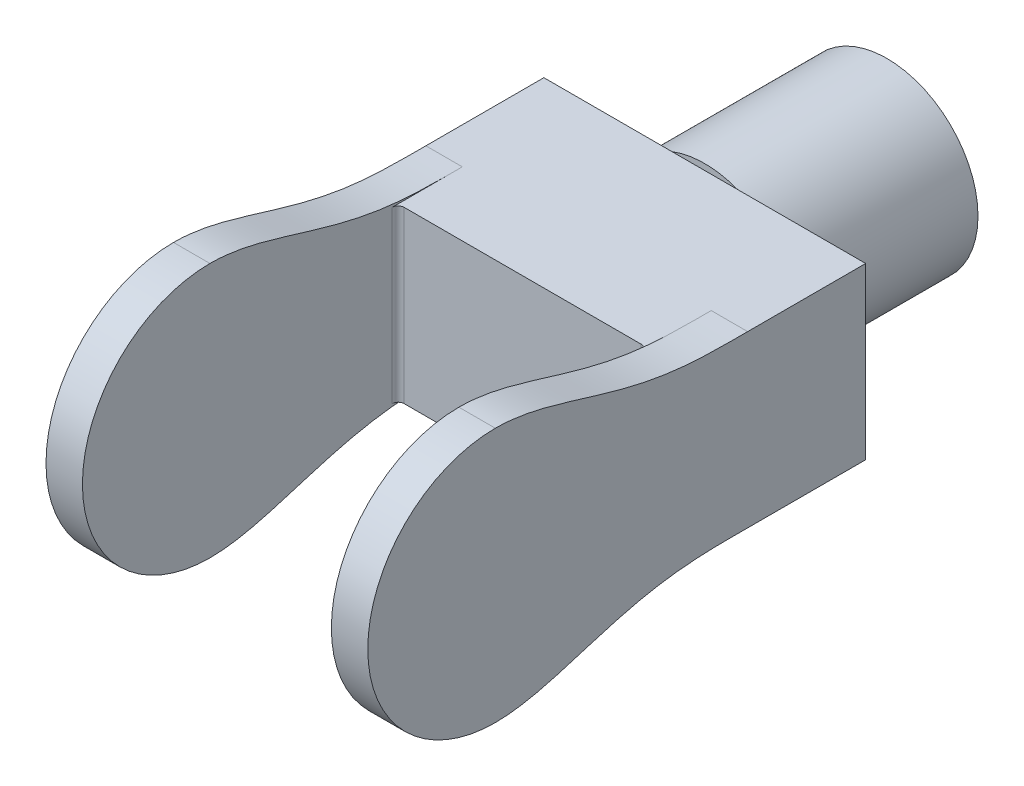
ISO-10303-21;
HEADER;
FILE_DESCRIPTION(('STEP AP214'),'2;1');
FILE_NAME('part.step','',(''),(''),'','','');
FILE_SCHEMA(('AUTOMOTIVE_DESIGN { 1 0 10303 214 1 1 1 1 }'));
ENDSEC;
DATA;
#1=APPLICATION_CONTEXT('core data for automotive mechanical design processes');
#2=APPLICATION_PROTOCOL_DEFINITION('international standard','automotive_design',2000,#1);
#3=PRODUCT_CONTEXT('',#1,'mechanical');
#4=PRODUCT('Part','Part','',(#3));
#5=PRODUCT_RELATED_PRODUCT_CATEGORY('part','',(#4));
#6=PRODUCT_DEFINITION_FORMATION('','',#4);
#7=PRODUCT_DEFINITION_CONTEXT('part definition',#1,'design');
#8=PRODUCT_DEFINITION('design','',#6,#7);
#9=PRODUCT_DEFINITION_SHAPE('','',#8);
#10=(LENGTH_UNIT() NAMED_UNIT(*) SI_UNIT(.MILLI.,.METRE.));
#11=(NAMED_UNIT(*) PLANE_ANGLE_UNIT() SI_UNIT($,.RADIAN.));
#12=(NAMED_UNIT(*) SI_UNIT($,.STERADIAN.) SOLID_ANGLE_UNIT());
#13=UNCERTAINTY_MEASURE_WITH_UNIT(LENGTH_MEASURE(1.E-05),#10,'distance_accuracy_value','');
#14=(GEOMETRIC_REPRESENTATION_CONTEXT(3) GLOBAL_UNCERTAINTY_ASSIGNED_CONTEXT((#13)) GLOBAL_UNIT_ASSIGNED_CONTEXT((#10,
#11,#12)) REPRESENTATION_CONTEXT('',''));
#15=CARTESIAN_POINT('',(0.,0.,0.));
#16=DIRECTION('',(0.,0.,1.));
#17=DIRECTION('',(1.,0.,0.));
#18=AXIS2_PLACEMENT_3D('',#15,#16,#17);
#19=CARTESIAN_POINT('',(0.,0.,60.));
#20=DIRECTION('',(0.,0.,1.));
#21=DIRECTION('',(1.,0.,0.));
#22=AXIS2_PLACEMENT_3D('',#19,#20,#21);
#23=PLANE('',#22);
#24=DIRECTION('',(-1.,0.,0.));
#25=VECTOR('',#24,1.);
#26=CARTESIAN_POINT('',(-26.5,14.,60.));
#27=LINE('',#26,#25);
#28=CARTESIAN_POINT('',(19.5,14.,60.));
#29=VERTEX_POINT('',#28);
#30=CARTESIAN_POINT('',(-19.5,14.,60.));
#31=VERTEX_POINT('',#30);
#32=EDGE_CURVE('E381',#29,#31,#27,.T.);
#33=ORIENTED_EDGE('',*,*,#32,.T.);
#34=DIRECTION('',(0.,-1.,0.));
#35=VECTOR('',#34,1.);
#36=CARTESIAN_POINT('',(-19.5,0.,60.));
#37=LINE('',#36,#35);
#38=CARTESIAN_POINT('',(-19.5,-14.,60.));
#39=VERTEX_POINT('',#38);
#40=EDGE_CURVE('E598',#31,#39,#37,.T.);
#41=ORIENTED_EDGE('',*,*,#40,.T.);
#42=DIRECTION('',(1.,0.,0.));
#43=VECTOR('',#42,1.);
#44=CARTESIAN_POINT('',(-26.5,-14.,60.));
#45=LINE('',#44,#43);
#46=CARTESIAN_POINT('',(19.5,-14.,60.));
#47=VERTEX_POINT('',#46);
#48=EDGE_CURVE('E387',#39,#47,#45,.T.);
#49=ORIENTED_EDGE('',*,*,#48,.T.);
#50=DIRECTION('',(0.,1.,0.));
#51=VECTOR('',#50,1.);
#52=CARTESIAN_POINT('',(19.5,0.,60.));
#53=LINE('',#52,#51);
#54=EDGE_CURVE('E533',#47,#29,#53,.T.);
#55=ORIENTED_EDGE('',*,*,#54,.T.);
#56=EDGE_LOOP('',(#33,#41,#49,#55));
#57=FACE_BOUND('',#56,.T.);
#58=ADVANCED_FACE('F34',(#57),#23,.T.);
#59=CARTESIAN_POINT('',(-26.5,-14.,60.));
#60=DIRECTION('',(0.,1.,0.));
#61=DIRECTION('',(0.,0.,1.));
#62=AXIS2_PLACEMENT_3D('',#59,#60,#61);
#63=PLANE('',#62);
#64=CARTESIAN_POINT('',(20.5,-13.9999999936666,52.0456716722797));
#65=CARTESIAN_POINT('',(20.5,-13.9982536224879,51.3984805592287));
#66=CARTESIAN_POINT('',(20.5,-13.9987783856783,50.7482018813313));
#67=CARTESIAN_POINT('',(20.5,-14.,50.0944013705871));
#68=CARTESIAN_POINT('',(20.5,-14.,49.4366105241134));
#69=B_SPLINE_CURVE_WITH_KNOTS('',4,(#64,#65,#66,#67,#68),.UNSPECIFIED.,.F.,.F.,(5,5),
(0.937729187400009,1.),.UNSPECIFIED.);
#70=CARTESIAN_POINT('',(20.5,-14.,52.0456716722829));
#71=VERTEX_POINT('',#70);
#72=CARTESIAN_POINT('',(20.5,-14.,49.4366105241134));
#73=VERTEX_POINT('',#72);
#74=EDGE_CURVE('E304',#71,#73,#69,.T.);
#75=ORIENTED_EDGE('',*,*,#74,.F.);
#76=DIRECTION('',(0.,0.,-1.));
#77=VECTOR('',#76,1.);
#78=CARTESIAN_POINT('',(20.5,-14.,60.));
#79=LINE('',#78,#77);
#80=CARTESIAN_POINT('',(20.5,-14.,61.));
#81=VERTEX_POINT('',#80);
#82=EDGE_CURVE('E56',#81,#71,#79,.T.);
#83=ORIENTED_EDGE('',*,*,#82,.F.);
#84=CARTESIAN_POINT('',(19.5,-14.,61.));
#85=DIRECTION('',(0.,1.,0.));
#86=DIRECTION('',(0.,0.,1.));
#87=AXIS2_PLACEMENT_3D('',#84,#85,#86);
#88=CIRCLE('',#87,1.);
#89=EDGE_CURVE('E11',#81,#47,#88,.T.);
#90=ORIENTED_EDGE('',*,*,#89,.T.);
#91=ORIENTED_EDGE('',*,*,#48,.F.);
#92=CARTESIAN_POINT('',(-19.5,-14.,61.));
#93=DIRECTION('',(0.,1.,0.));
#94=DIRECTION('',(0.,0.,1.));
#95=AXIS2_PLACEMENT_3D('',#92,#93,#94);
#96=CIRCLE('',#95,1.);
#97=CARTESIAN_POINT('',(-20.5,-14.,61.));
#98=VERTEX_POINT('',#97);
#99=EDGE_CURVE('E609',#39,#98,#96,.T.);
#100=ORIENTED_EDGE('',*,*,#99,.T.);
#101=DIRECTION('',(0.,0.,1.));
#102=VECTOR('',#101,1.);
#103=CARTESIAN_POINT('',(-20.5,-14.,60.));
#104=LINE('',#103,#102);
#105=CARTESIAN_POINT('',(-20.5,-14.,52.0456716722829));
#106=VERTEX_POINT('',#105);
#107=EDGE_CURVE('E204',#106,#98,#104,.T.);
#108=ORIENTED_EDGE('',*,*,#107,.F.);
#109=CARTESIAN_POINT('',(-20.5,-14.,49.4366105241134));
#110=CARTESIAN_POINT('',(-20.5,-14.,50.0944013705871));
#111=CARTESIAN_POINT('',(-20.5,-13.9987783856783,50.7482018813313));
#112=CARTESIAN_POINT('',(-20.5,-13.9982536224879,51.3984805592287));
#113=CARTESIAN_POINT('',(-20.5,-13.9999999936666,52.0456716722797));
#114=B_SPLINE_CURVE_WITH_KNOTS('',4,(#109,#110,#111,#112,#113),.UNSPECIFIED.,.F.,.F.,(5,5),
(0.937729187400009,1.),.UNSPECIFIED.);
#115=CARTESIAN_POINT('',(-20.5,-14.,49.4366105241134));
#116=VERTEX_POINT('',#115);
#117=EDGE_CURVE('E197',#106,#116,#114,.F.);
#118=ORIENTED_EDGE('',*,*,#117,.T.);
#119=DIRECTION('',(-1.,0.,0.));
#120=VECTOR('',#119,1.);
#121=CARTESIAN_POINT('',(-20.5,-14.,49.4366105241134));
#122=LINE('',#121,#120);
#123=CARTESIAN_POINT('',(-26.5,-14.,49.4366105241134));
#124=VERTEX_POINT('',#123);
#125=EDGE_CURVE('E192',#116,#124,#122,.T.);
#126=ORIENTED_EDGE('',*,*,#125,.T.);
#127=DIRECTION('',(0.,0.,-1.));
#128=VECTOR('',#127,1.);
#129=CARTESIAN_POINT('',(-26.5,-14.,60.));
#130=LINE('',#129,#128);
#131=CARTESIAN_POINT('',(-26.5,-14.,30.));
#132=VERTEX_POINT('',#131);
#133=EDGE_CURVE('E414',#124,#132,#130,.T.);
#134=ORIENTED_EDGE('',*,*,#133,.T.);
#135=DIRECTION('',(1.,0.,0.));
#136=VECTOR('',#135,1.);
#137=CARTESIAN_POINT('',(-26.5,-14.,30.));
#138=LINE('',#137,#136);
#139=CARTESIAN_POINT('',(-5.3851648071345,-14.,30.));
#140=VERTEX_POINT('',#139);
#141=EDGE_CURVE('E388',#132,#140,#138,.T.);
#142=ORIENTED_EDGE('',*,*,#141,.T.);
#143=CARTESIAN_POINT('',(5.3851648071345,-14.,30.));
#144=VERTEX_POINT('',#143);
#145=EDGE_CURVE('E406',#140,#144,#138,.T.);
#146=ORIENTED_EDGE('',*,*,#145,.T.);
#147=CARTESIAN_POINT('',(26.5,-14.,30.));
#148=VERTEX_POINT('',#147);
#149=EDGE_CURVE('E403',#144,#148,#138,.T.);
#150=ORIENTED_EDGE('',*,*,#149,.T.);
#151=DIRECTION('',(0.,0.,-1.));
#152=VECTOR('',#151,1.);
#153=CARTESIAN_POINT('',(26.5,-14.,60.));
#154=LINE('',#153,#152);
#155=CARTESIAN_POINT('',(26.5,-14.,49.4366105241134));
#156=VERTEX_POINT('',#155);
#157=EDGE_CURVE('E391',#156,#148,#154,.T.);
#158=ORIENTED_EDGE('',*,*,#157,.F.);
#159=DIRECTION('',(1.,0.,0.));
#160=VECTOR('',#159,1.);
#161=CARTESIAN_POINT('',(20.5,-14.,49.4366105241134));
#162=LINE('',#161,#160);
#163=EDGE_CURVE('E335',#73,#156,#162,.T.);
#164=ORIENTED_EDGE('',*,*,#163,.F.);
#165=EDGE_LOOP('',(#75,#83,#90,#91,#100,#108,#118,#126,#134,#142,#146,#150,#158,#164));
#166=FACE_BOUND('',#165,.T.);
#167=ADVANCED_FACE('F471',(#166),#63,.F.);
#168=CARTESIAN_POINT('',(-26.5,14.,60.));
#169=DIRECTION('',(0.,-1.,0.));
#170=DIRECTION('',(0.,0.,-1.));
#171=AXIS2_PLACEMENT_3D('',#168,#169,#170);
#172=PLANE('',#171);
#173=DIRECTION('',(-1.,0.,0.));
#174=VECTOR('',#173,1.);
#175=CARTESIAN_POINT('',(-20.5,14.,49.4366105241134));
#176=LINE('',#175,#174);
#177=CARTESIAN_POINT('',(-20.5,14.,49.4366105241134));
#178=VERTEX_POINT('',#177);
#179=CARTESIAN_POINT('',(-26.5,14.,49.4366105241134));
#180=VERTEX_POINT('',#179);
#181=EDGE_CURVE('E181',#178,#180,#176,.T.);
#182=ORIENTED_EDGE('',*,*,#181,.F.);
#183=CARTESIAN_POINT('',(-20.5,13.9999999936666,52.0456716722725));
#184=CARTESIAN_POINT('',(-20.5,13.9982536224879,51.3984805592233));
#185=CARTESIAN_POINT('',(-20.5,13.9987783856784,50.7482018813277));
#186=CARTESIAN_POINT('',(-20.5,14.,50.0944013705852));
#187=CARTESIAN_POINT('',(-20.5,14.,49.4366105241134));
#188=B_SPLINE_CURVE_WITH_KNOTS('',4,(#183,#184,#185,#186,#187),.UNSPECIFIED.,.F.,.F.,(5,5),(0.,
0.0622708125998166),.UNSPECIFIED.);
#189=CARTESIAN_POINT('',(-20.5,14.,52.0456716722757));
#190=VERTEX_POINT('',#189);
#191=EDGE_CURVE('E200',#178,#190,#188,.F.);
#192=ORIENTED_EDGE('',*,*,#191,.T.);
#193=DIRECTION('',(0.,0.,-1.));
#194=VECTOR('',#193,1.);
#195=CARTESIAN_POINT('',(-20.5,14.,60.));
#196=LINE('',#195,#194);
#197=CARTESIAN_POINT('',(-20.5,14.,61.));
#198=VERTEX_POINT('',#197);
#199=EDGE_CURVE('E614',#198,#190,#196,.T.);
#200=ORIENTED_EDGE('',*,*,#199,.F.);
#201=CARTESIAN_POINT('',(-19.5,14.,61.));
#202=DIRECTION('',(0.,-1.,0.));
#203=DIRECTION('',(0.,0.,-1.));
#204=AXIS2_PLACEMENT_3D('',#201,#202,#203);
#205=CIRCLE('',#204,1.);
#206=EDGE_CURVE('E612',#198,#31,#205,.T.);
#207=ORIENTED_EDGE('',*,*,#206,.T.);
#208=ORIENTED_EDGE('',*,*,#32,.F.);
#209=CARTESIAN_POINT('',(19.5,14.,61.));
#210=DIRECTION('',(0.,-1.,0.));
#211=DIRECTION('',(0.,0.,-1.));
#212=AXIS2_PLACEMENT_3D('',#209,#210,#211);
#213=CIRCLE('',#212,1.);
#214=CARTESIAN_POINT('',(20.5,14.,61.));
#215=VERTEX_POINT('',#214);
#216=EDGE_CURVE('E42',#29,#215,#213,.T.);
#217=ORIENTED_EDGE('',*,*,#216,.T.);
#218=DIRECTION('',(0.,0.,1.));
#219=VECTOR('',#218,1.);
#220=CARTESIAN_POINT('',(20.5,14.,60.));
#221=LINE('',#220,#219);
#222=CARTESIAN_POINT('',(20.5,14.,52.0456716722757));
#223=VERTEX_POINT('',#222);
#224=EDGE_CURVE('E49',#223,#215,#221,.T.);
#225=ORIENTED_EDGE('',*,*,#224,.F.);
#226=CARTESIAN_POINT('',(20.5,14.,49.4366105241134));
#227=CARTESIAN_POINT('',(20.5,14.,50.0944013705852));
#228=CARTESIAN_POINT('',(20.5,13.9987783856784,50.7482018813277));
#229=CARTESIAN_POINT('',(20.5,13.9982536224879,51.3984805592233));
#230=CARTESIAN_POINT('',(20.5,13.9999999936666,52.0456716722725));
#231=B_SPLINE_CURVE_WITH_KNOTS('',4,(#226,#227,#228,#229,#230),.UNSPECIFIED.,.F.,.F.,(5,5),(0.,
0.0622708125998166),.UNSPECIFIED.);
#232=CARTESIAN_POINT('',(20.5,14.,49.4366105241134));
#233=VERTEX_POINT('',#232);
#234=EDGE_CURVE('E295',#233,#223,#231,.T.);
#235=ORIENTED_EDGE('',*,*,#234,.F.);
#236=DIRECTION('',(1.,0.,0.));
#237=VECTOR('',#236,1.);
#238=CARTESIAN_POINT('',(20.5,14.,49.4366105241134));
#239=LINE('',#238,#237);
#240=CARTESIAN_POINT('',(26.5,14.,49.4366105241134));
#241=VERTEX_POINT('',#240);
#242=EDGE_CURVE('E337',#233,#241,#239,.T.);
#243=ORIENTED_EDGE('',*,*,#242,.T.);
#244=DIRECTION('',(0.,0.,-1.));
#245=VECTOR('',#244,1.);
#246=CARTESIAN_POINT('',(26.5,14.,60.));
#247=LINE('',#246,#245);
#248=CARTESIAN_POINT('',(26.5,14.,30.));
#249=VERTEX_POINT('',#248);
#250=EDGE_CURVE('E425',#241,#249,#247,.T.);
#251=ORIENTED_EDGE('',*,*,#250,.T.);
#252=DIRECTION('',(-1.,0.,0.));
#253=VECTOR('',#252,1.);
#254=CARTESIAN_POINT('',(-26.5,14.,30.));
#255=LINE('',#254,#253);
#256=CARTESIAN_POINT('',(5.38516480713451,14.,30.));
#257=VERTEX_POINT('',#256);
#258=EDGE_CURVE('E396',#249,#257,#255,.T.);
#259=ORIENTED_EDGE('',*,*,#258,.T.);
#260=CARTESIAN_POINT('',(-5.38516480713451,14.,30.));
#261=VERTEX_POINT('',#260);
#262=EDGE_CURVE('E400',#257,#261,#255,.T.);
#263=ORIENTED_EDGE('',*,*,#262,.T.);
#264=CARTESIAN_POINT('',(-26.5,14.,30.));
#265=VERTEX_POINT('',#264);
#266=EDGE_CURVE('E395',#261,#265,#255,.T.);
#267=ORIENTED_EDGE('',*,*,#266,.T.);
#268=DIRECTION('',(0.,0.,-1.));
#269=VECTOR('',#268,1.);
#270=CARTESIAN_POINT('',(-26.5,14.,60.));
#271=LINE('',#270,#269);
#272=EDGE_CURVE('E521',#180,#265,#271,.T.);
#273=ORIENTED_EDGE('',*,*,#272,.F.);
#274=EDGE_LOOP('',(#182,#192,#200,#207,#208,#217,#225,#235,#243,#251,#259,#263,#267,#273));
#275=FACE_BOUND('',#274,.T.);
#276=ADVANCED_FACE('F439',(#275),#172,.F.);
#277=CARTESIAN_POINT('',(26.5,14.,60.));
#278=DIRECTION('',(-1.,0.,0.));
#279=DIRECTION('',(0.,-1.,0.));
#280=AXIS2_PLACEMENT_3D('',#277,#278,#279);
#281=PLANE('',#280);
#282=ORIENTED_EDGE('',*,*,#250,.F.);
#283=CARTESIAN_POINT('',(26.5,13.9999999936666,52.0456716722725));
#284=CARTESIAN_POINT('',(26.5,13.9982536224879,51.3984805592233));
#285=CARTESIAN_POINT('',(26.5,13.9987783856784,50.7482018813277));
#286=CARTESIAN_POINT('',(26.5,14.,50.0944013705852));
#287=CARTESIAN_POINT('',(26.5,14.,49.4366105241134));
#288=B_SPLINE_CURVE_WITH_KNOTS('',4,(#283,#284,#285,#286,#287),.UNSPECIFIED.,.F.,.F.,(5,5),(0.,
0.0622708125998166),.UNSPECIFIED.);
#289=CARTESIAN_POINT('',(26.5,14.,52.0456716722757));
#290=VERTEX_POINT('',#289);
#291=EDGE_CURVE('E366',#241,#290,#288,.F.);
#292=ORIENTED_EDGE('',*,*,#291,.T.);
#293=CARTESIAN_POINT('',(26.5,14.,49.4366105241134));
#294=CARTESIAN_POINT('',(26.5,14.,60.));
#295=CARTESIAN_POINT('',(26.5,13.6849604710596,69.5343302497273));
#296=CARTESIAN_POINT('',(26.5,21.,79.9798556334345));
#297=CARTESIAN_POINT('',(26.5,21.,91.));
#298=B_SPLINE_CURVE_WITH_KNOTS('',4,(#293,#294,#295,#296,#297),.UNSPECIFIED.,.F.,.F.,(5,5),(0.,
1.),.UNSPECIFIED.);
#299=CARTESIAN_POINT('',(26.5,21.,91.));
#300=VERTEX_POINT('',#299);
#301=EDGE_CURVE('E370',#290,#300,#298,.T.);
#302=ORIENTED_EDGE('',*,*,#301,.T.);
#303=CARTESIAN_POINT('',(26.5,0.,91.));
#304=DIRECTION('',(1.,0.,0.));
#305=DIRECTION('',(0.,1.,0.));
#306=AXIS2_PLACEMENT_3D('',#303,#304,#305);
#307=CIRCLE('',#306,21.);
#308=CARTESIAN_POINT('',(26.5,-21.,91.));
#309=VERTEX_POINT('',#308);
#310=EDGE_CURVE('E326',#300,#309,#307,.T.);
#311=ORIENTED_EDGE('',*,*,#310,.T.);
#312=CARTESIAN_POINT('',(26.5,-21.,91.));
#313=CARTESIAN_POINT('',(26.5,-21.,79.9798556334345));
#314=CARTESIAN_POINT('',(26.5,-13.6849604710596,69.5343302497273));
#315=CARTESIAN_POINT('',(26.5,-14.,60.));
#316=CARTESIAN_POINT('',(26.5,-14.,49.4366105241134));
#317=B_SPLINE_CURVE_WITH_KNOTS('',4,(#312,#313,#314,#315,#316),.UNSPECIFIED.,.F.,.F.,(5,5),(0.,
1.),.UNSPECIFIED.);
#318=CARTESIAN_POINT('',(26.5,-14.,52.0456716722829));
#319=VERTEX_POINT('',#318);
#320=EDGE_CURVE('E296',#309,#319,#317,.T.);
#321=ORIENTED_EDGE('',*,*,#320,.T.);
#322=CARTESIAN_POINT('',(26.5,-14.,49.4366105241134));
#323=CARTESIAN_POINT('',(26.5,-14.,50.0944013705871));
#324=CARTESIAN_POINT('',(26.5,-13.9987783856783,50.7482018813313));
#325=CARTESIAN_POINT('',(26.5,-13.9982536224879,51.3984805592287));
#326=CARTESIAN_POINT('',(26.5,-13.9999999936666,52.0456716722797));
#327=B_SPLINE_CURVE_WITH_KNOTS('',4,(#322,#323,#324,#325,#326),.UNSPECIFIED.,.F.,.F.,(5,5),
(0.937729187400009,1.),.UNSPECIFIED.);
#328=EDGE_CURVE('E343',#319,#156,#327,.F.);
#329=ORIENTED_EDGE('',*,*,#328,.T.);
#330=ORIENTED_EDGE('',*,*,#157,.T.);
#331=DIRECTION('',(0.,1.,0.));
#332=VECTOR('',#331,1.);
#333=CARTESIAN_POINT('',(26.5,14.,30.));
#334=LINE('',#333,#332);
#335=EDGE_CURVE('E392',#148,#249,#334,.T.);
#336=ORIENTED_EDGE('',*,*,#335,.T.);
#337=EDGE_LOOP('',(#282,#292,#302,#311,#321,#329,#330,#336));
#338=FACE_BOUND('',#337,.T.);
#339=ADVANCED_FACE('F428',(#338),#281,.F.);
#340=CARTESIAN_POINT('',(0.,0.,30.));
#341=DIRECTION('',(0.,0.,1.));
#342=DIRECTION('',(1.,0.,0.));
#343=AXIS2_PLACEMENT_3D('',#340,#341,#342);
#344=PLANE('',#343);
#345=ORIENTED_EDGE('',*,*,#145,.F.);
#346=CARTESIAN_POINT('',(0.,0.,30.));
#347=DIRECTION('',(0.,0.,1.));
#348=DIRECTION('',(1.,0.,0.));
#349=AXIS2_PLACEMENT_3D('',#346,#347,#348);
#350=CIRCLE('',#349,15.);
#351=EDGE_CURVE('E793',#140,#144,#350,.T.);
#352=ORIENTED_EDGE('',*,*,#351,.T.);
#353=EDGE_LOOP('',(#345,#352));
#354=FACE_BOUND('',#353,.T.);
#355=ADVANCED_FACE('F438',(#354),#344,.T.);
#356=CARTESIAN_POINT('',(0.,0.,30.));
#357=DIRECTION('',(0.,0.,-1.));
#358=DIRECTION('',(-1.,0.,0.));
#359=AXIS2_PLACEMENT_3D('',#356,#357,#358);
#360=CYLINDRICAL_SURFACE('',#359,13.);
#361=CARTESIAN_POINT('',(0.,0.,0.));
#362=DIRECTION('',(0.,0.,1.));
#363=DIRECTION('',(1.,0.,0.));
#364=AXIS2_PLACEMENT_3D('',#361,#362,#363);
#365=CIRCLE('',#364,13.);
#366=CARTESIAN_POINT('',(13.,0.,0.));
#367=VERTEX_POINT('',#366);
#368=EDGE_CURVE('E538',#367,#367,#365,.T.);
#369=ORIENTED_EDGE('',*,*,#368,.F.);
#370=EDGE_LOOP('',(#369));
#371=FACE_BOUND('',#370,.T.);
#372=CARTESIAN_POINT('',(0.,0.,27.));
#373=DIRECTION('',(0.,0.,1.));
#374=DIRECTION('',(1.,0.,0.));
#375=AXIS2_PLACEMENT_3D('',#372,#373,#374);
#376=CIRCLE('',#375,13.);
#377=CARTESIAN_POINT('',(13.,0.,27.));
#378=VERTEX_POINT('',#377);
#379=EDGE_CURVE('E542',#378,#378,#376,.T.);
#380=ORIENTED_EDGE('',*,*,#379,.T.);
#381=EDGE_LOOP('',(#380));
#382=FACE_BOUND('',#381,.T.);
#383=ADVANCED_FACE('F449',(#371,#382),#360,.F.);
#384=ORIENTED_EDGE('',*,*,#262,.F.);
#385=EDGE_CURVE('E543',#257,#261,#350,.T.);
#386=ORIENTED_EDGE('',*,*,#385,.T.);
#387=EDGE_LOOP('',(#384,#386));
#388=FACE_BOUND('',#387,.T.);
#389=ADVANCED_FACE('F452',(#388),#344,.T.);
#390=CARTESIAN_POINT('',(0.,0.,0.));
#391=DIRECTION('',(0.,0.,1.));
#392=DIRECTION('',(1.,0.,0.));
#393=AXIS2_PLACEMENT_3D('',#390,#391,#392);
#394=PLANE('',#393);
#395=CARTESIAN_POINT('',(0.,0.,0.));
#396=DIRECTION('',(0.,0.,1.));
#397=DIRECTION('',(1.,0.,0.));
#398=AXIS2_PLACEMENT_3D('',#395,#396,#397);
#399=CIRCLE('',#398,15.);
#400=CARTESIAN_POINT('',(15.,0.,0.));
#401=VERTEX_POINT('',#400);
#402=EDGE_CURVE('E541',#401,#401,#399,.T.);
#403=ORIENTED_EDGE('',*,*,#402,.F.);
#404=EDGE_LOOP('',(#403));
#405=FACE_BOUND('',#404,.T.);
#406=ORIENTED_EDGE('',*,*,#368,.T.);
#407=EDGE_LOOP('',(#406));
#408=FACE_BOUND('',#407,.T.);
#409=ADVANCED_FACE('F456',(#405,#408),#394,.F.);
#410=CARTESIAN_POINT('',(0.,0.,30.));
#411=DIRECTION('',(0.,0.,-1.));
#412=DIRECTION('',(-1.,0.,0.));
#413=AXIS2_PLACEMENT_3D('',#410,#411,#412);
#414=CYLINDRICAL_SURFACE('',#413,15.);
#415=ORIENTED_EDGE('',*,*,#385,.F.);
#416=EDGE_CURVE('E546',#144,#257,#350,.T.);
#417=ORIENTED_EDGE('',*,*,#416,.F.);
#418=ORIENTED_EDGE('',*,*,#351,.F.);
#419=EDGE_CURVE('E545',#261,#140,#350,.T.);
#420=ORIENTED_EDGE('',*,*,#419,.F.);
#421=EDGE_LOOP('',(#415,#417,#418,#420));
#422=FACE_BOUND('',#421,.T.);
#423=ORIENTED_EDGE('',*,*,#402,.T.);
#424=EDGE_LOOP('',(#423));
#425=FACE_BOUND('',#424,.T.);
#426=ADVANCED_FACE('F447',(#422,#425),#414,.T.);
#427=CARTESIAN_POINT('',(0.,0.,27.));
#428=DIRECTION('',(0.,0.,1.));
#429=DIRECTION('',(1.,0.,0.));
#430=AXIS2_PLACEMENT_3D('',#427,#428,#429);
#431=PLANE('',#430);
#432=ORIENTED_EDGE('',*,*,#379,.F.);
#433=EDGE_LOOP('',(#432));
#434=FACE_BOUND('',#433,.T.);
#435=ADVANCED_FACE('F442',(#434),#431,.F.);
#436=CARTESIAN_POINT('',(0.,0.,30.));
#437=DIRECTION('',(0.,0.,1.));
#438=DIRECTION('',(1.,0.,0.));
#439=AXIS2_PLACEMENT_3D('',#436,#437,#438);
#440=PLANE('',#439);
#441=ORIENTED_EDGE('',*,*,#266,.F.);
#442=ORIENTED_EDGE('',*,*,#419,.T.);
#443=ORIENTED_EDGE('',*,*,#141,.F.);
#444=DIRECTION('',(0.,-1.,0.));
#445=VECTOR('',#444,1.);
#446=CARTESIAN_POINT('',(-26.5,14.,30.));
#447=LINE('',#446,#445);
#448=EDGE_CURVE('E399',#265,#132,#447,.T.);
#449=ORIENTED_EDGE('',*,*,#448,.F.);
#450=EDGE_LOOP('',(#441,#442,#443,#449));
#451=FACE_BOUND('',#450,.T.);
#452=ADVANCED_FACE('F446',(#451),#440,.F.);
#453=ORIENTED_EDGE('',*,*,#149,.F.);
#454=ORIENTED_EDGE('',*,*,#416,.T.);
#455=ORIENTED_EDGE('',*,*,#258,.F.);
#456=ORIENTED_EDGE('',*,*,#335,.F.);
#457=EDGE_LOOP('',(#453,#454,#455,#456));
#458=FACE_BOUND('',#457,.T.);
#459=ADVANCED_FACE('F479',(#458),#440,.F.);
#460=CARTESIAN_POINT('',(-26.5,14.,60.));
#461=DIRECTION('',(1.,0.,0.));
#462=DIRECTION('',(0.,1.,0.));
#463=AXIS2_PLACEMENT_3D('',#460,#461,#462);
#464=PLANE('',#463);
#465=CARTESIAN_POINT('',(-26.5,-13.9999999936666,52.045671672268));
#466=CARTESIAN_POINT('',(-26.5,-13.9982536224879,51.3984805592199));
#467=CARTESIAN_POINT('',(-26.5,-13.9987783856784,50.7482018813254));
#468=CARTESIAN_POINT('',(-26.5,-14.,50.0944013705841));
#469=CARTESIAN_POINT('',(-26.5,-14.,49.4366105241134));
#470=B_SPLINE_CURVE_WITH_KNOTS('',4,(#465,#466,#467,#468,#469),.UNSPECIFIED.,.F.,.F.,(5,5),
(0.937729187400291,1.),.UNSPECIFIED.);
#471=CARTESIAN_POINT('',(-26.5,-14.,52.0456716722829));
#472=VERTEX_POINT('',#471);
#473=EDGE_CURVE('E511',#472,#124,#470,.T.);
#474=ORIENTED_EDGE('',*,*,#473,.F.);
#475=CARTESIAN_POINT('',(-26.5,-21.,91.));
#476=CARTESIAN_POINT('',(-26.5,-21.,79.9798556334345));
#477=CARTESIAN_POINT('',(-26.5,-13.6849604710596,69.5343302497273));
#478=CARTESIAN_POINT('',(-26.5,-14.,60.));
#479=CARTESIAN_POINT('',(-26.5,-14.,49.4366105241134));
#480=B_SPLINE_CURVE_WITH_KNOTS('',4,(#475,#476,#477,#478,#479),.UNSPECIFIED.,.F.,.F.,(5,5),(0.,
1.),.UNSPECIFIED.);
#481=CARTESIAN_POINT('',(-26.5,-21.,91.));
#482=VERTEX_POINT('',#481);
#483=EDGE_CURVE('E240',#482,#472,#480,.T.);
#484=ORIENTED_EDGE('',*,*,#483,.F.);
#485=CARTESIAN_POINT('',(-26.5,0.,91.));
#486=DIRECTION('',(1.,0.,0.));
#487=DIRECTION('',(0.,1.,0.));
#488=AXIS2_PLACEMENT_3D('',#485,#486,#487);
#489=CIRCLE('',#488,21.);
#490=CARTESIAN_POINT('',(-26.5,21.,91.));
#491=VERTEX_POINT('',#490);
#492=EDGE_CURVE('E187',#491,#482,#489,.T.);
#493=ORIENTED_EDGE('',*,*,#492,.F.);
#494=CARTESIAN_POINT('',(-26.5,14.,49.4366105241134));
#495=CARTESIAN_POINT('',(-26.5,14.,60.));
#496=CARTESIAN_POINT('',(-26.5,13.6849604710596,69.5343302497273));
#497=CARTESIAN_POINT('',(-26.5,21.,79.9798556334345));
#498=CARTESIAN_POINT('',(-26.5,21.,91.));
#499=B_SPLINE_CURVE_WITH_KNOTS('',4,(#494,#495,#496,#497,#498),.UNSPECIFIED.,.F.,.F.,(5,5),(0.,
1.),.UNSPECIFIED.);
#500=CARTESIAN_POINT('',(-26.5,14.,52.0456716722757));
#501=VERTEX_POINT('',#500);
#502=EDGE_CURVE('E262',#501,#491,#499,.T.);
#503=ORIENTED_EDGE('',*,*,#502,.F.);
#504=CARTESIAN_POINT('',(-26.5,14.,49.4366105241134));
#505=CARTESIAN_POINT('',(-26.5,14.,50.0944013705822));
#506=CARTESIAN_POINT('',(-26.5,13.9987783856784,50.7482018813217));
#507=CARTESIAN_POINT('',(-26.5,13.9982536224879,51.3984805592144));
#508=CARTESIAN_POINT('',(-26.5,13.9999999936666,52.0456716722607));
#509=B_SPLINE_CURVE_WITH_KNOTS('',4,(#504,#505,#506,#507,#508),.UNSPECIFIED.,.F.,.F.,(5,5),(0.,
0.0622708125995346),.UNSPECIFIED.);
#510=EDGE_CURVE('E247',#180,#501,#509,.T.);
#511=ORIENTED_EDGE('',*,*,#510,.F.);
#512=ORIENTED_EDGE('',*,*,#272,.T.);
#513=ORIENTED_EDGE('',*,*,#448,.T.);
#514=ORIENTED_EDGE('',*,*,#133,.F.);
#515=EDGE_LOOP('',(#474,#484,#493,#503,#511,#512,#513,#514));
#516=FACE_BOUND('',#515,.T.);
#517=ADVANCED_FACE('F482',(#516),#464,.F.);
#518=CARTESIAN_POINT('',(20.5,16.0693601766473,69.8476259097634));
#519=DIRECTION('',(1.,0.,0.));
#520=DIRECTION('',(0.,1.,0.));
#521=AXIS2_PLACEMENT_3D('',#518,#519,#520);
#522=PLANE('',#521);
#523=ORIENTED_EDGE('',*,*,#224,.T.);
#524=DIRECTION('',(0.,1.,0.));
#525=VECTOR('',#524,1.);
#526=CARTESIAN_POINT('',(20.5,16.0693601766473,61.));
#527=LINE('',#526,#525);
#528=EDGE_CURVE('E565',#215,#81,#527,.F.);
#529=ORIENTED_EDGE('',*,*,#528,.T.);
#530=ORIENTED_EDGE('',*,*,#82,.T.);
#531=CARTESIAN_POINT('',(20.5,-21.,91.));
#532=CARTESIAN_POINT('',(20.5,-21.,79.9798556334345));
#533=CARTESIAN_POINT('',(20.5,-13.6849604710596,69.5343302497273));
#534=CARTESIAN_POINT('',(20.5,-14.,60.));
#535=CARTESIAN_POINT('',(20.5,-14.,49.4366105241134));
#536=B_SPLINE_CURVE_WITH_KNOTS('',4,(#531,#532,#533,#534,#535),.UNSPECIFIED.,.F.,.F.,(5,5),(0.,
1.),.UNSPECIFIED.);
#537=CARTESIAN_POINT('',(20.5,-21.,91.));
#538=VERTEX_POINT('',#537);
#539=EDGE_CURVE('E332',#538,#71,#536,.T.);
#540=ORIENTED_EDGE('',*,*,#539,.F.);
#541=CARTESIAN_POINT('',(20.5,0.,91.));
#542=DIRECTION('',(1.,0.,0.));
#543=DIRECTION('',(0.,1.,0.));
#544=AXIS2_PLACEMENT_3D('',#541,#542,#543);
#545=CIRCLE('',#544,21.);
#546=CARTESIAN_POINT('',(20.5,21.,91.));
#547=VERTEX_POINT('',#546);
#548=EDGE_CURVE('E280',#547,#538,#545,.T.);
#549=ORIENTED_EDGE('',*,*,#548,.F.);
#550=CARTESIAN_POINT('',(20.5,14.,49.4366105241134));
#551=CARTESIAN_POINT('',(20.5,14.,60.));
#552=CARTESIAN_POINT('',(20.5,13.6849604710596,69.5343302497273));
#553=CARTESIAN_POINT('',(20.5,21.,79.9798556334345));
#554=CARTESIAN_POINT('',(20.5,21.,91.));
#555=B_SPLINE_CURVE_WITH_KNOTS('',4,(#550,#551,#552,#553,#554),.UNSPECIFIED.,.F.,.F.,(5,5),(0.,
1.),.UNSPECIFIED.);
#556=EDGE_CURVE('E292',#223,#547,#555,.T.);
#557=ORIENTED_EDGE('',*,*,#556,.F.);
#558=EDGE_LOOP('',(#523,#529,#530,#540,#549,#557));
#559=FACE_BOUND('',#558,.T.);
#560=ADVANCED_FACE('F320',(#559),#522,.F.);
#561=DIRECTION('',(1.,0.,0.));
#562=VECTOR('',#561,1.);
#563=SURFACE_OF_LINEAR_EXTRUSION('',#555,#562);
#564=ORIENTED_EDGE('',*,*,#291,.F.);
#565=ORIENTED_EDGE('',*,*,#242,.F.);
#566=ORIENTED_EDGE('',*,*,#234,.T.);
#567=ORIENTED_EDGE('',*,*,#556,.T.);
#568=DIRECTION('',(1.,0.,0.));
#569=VECTOR('',#568,1.);
#570=CARTESIAN_POINT('',(20.5,21.,91.));
#571=LINE('',#570,#569);
#572=EDGE_CURVE('E334',#547,#300,#571,.T.);
#573=ORIENTED_EDGE('',*,*,#572,.T.);
#574=ORIENTED_EDGE('',*,*,#301,.F.);
#575=EDGE_LOOP('',(#564,#565,#566,#567,#573,#574));
#576=FACE_BOUND('',#575,.T.);
#577=ADVANCED_FACE('F287',(#576),#563,.T.);
#578=DIRECTION('',(1.,0.,0.));
#579=VECTOR('',#578,1.);
#580=SURFACE_OF_LINEAR_EXTRUSION('',#536,#579);
#581=ORIENTED_EDGE('',*,*,#320,.F.);
#582=DIRECTION('',(1.,0.,0.));
#583=VECTOR('',#582,1.);
#584=CARTESIAN_POINT('',(20.5,-21.,91.));
#585=LINE('',#584,#583);
#586=EDGE_CURVE('E338',#538,#309,#585,.T.);
#587=ORIENTED_EDGE('',*,*,#586,.F.);
#588=ORIENTED_EDGE('',*,*,#539,.T.);
#589=ORIENTED_EDGE('',*,*,#74,.T.);
#590=ORIENTED_EDGE('',*,*,#163,.T.);
#591=ORIENTED_EDGE('',*,*,#328,.F.);
#592=EDGE_LOOP('',(#581,#587,#588,#589,#590,#591));
#593=FACE_BOUND('',#592,.T.);
#594=ADVANCED_FACE('F311',(#593),#580,.T.);
#595=CARTESIAN_POINT('',(20.5,0.,91.));
#596=DIRECTION('',(1.,0.,0.));
#597=DIRECTION('',(0.,1.,0.));
#598=AXIS2_PLACEMENT_3D('',#595,#596,#597);
#599=CYLINDRICAL_SURFACE('',#598,21.);
#600=ORIENTED_EDGE('',*,*,#310,.F.);
#601=ORIENTED_EDGE('',*,*,#572,.F.);
#602=ORIENTED_EDGE('',*,*,#548,.T.);
#603=ORIENTED_EDGE('',*,*,#586,.T.);
#604=EDGE_LOOP('',(#600,#601,#602,#603));
#605=FACE_BOUND('',#604,.T.);
#606=ADVANCED_FACE('F319',(#605),#599,.T.);
#607=CARTESIAN_POINT('',(-20.5,16.0693601766473,69.8476259097634));
#608=DIRECTION('',(-1.,0.,0.));
#609=DIRECTION('',(0.,1.,0.));
#610=AXIS2_PLACEMENT_3D('',#607,#608,#609);
#611=PLANE('',#610);
#612=ORIENTED_EDGE('',*,*,#107,.T.);
#613=DIRECTION('',(0.,-1.,0.));
#614=VECTOR('',#613,1.);
#615=CARTESIAN_POINT('',(-20.5,16.0693601766473,61.));
#616=LINE('',#615,#614);
#617=EDGE_CURVE('E602',#98,#198,#616,.F.);
#618=ORIENTED_EDGE('',*,*,#617,.T.);
#619=ORIENTED_EDGE('',*,*,#199,.T.);
#620=CARTESIAN_POINT('',(-20.5,14.,49.4366105241134));
#621=CARTESIAN_POINT('',(-20.5,14.,60.));
#622=CARTESIAN_POINT('',(-20.5,13.6849604710596,69.5343302497273));
#623=CARTESIAN_POINT('',(-20.5,21.,79.9798556334345));
#624=CARTESIAN_POINT('',(-20.5,21.,91.));
#625=B_SPLINE_CURVE_WITH_KNOTS('',4,(#620,#621,#622,#623,#624),.UNSPECIFIED.,.F.,.F.,(5,5),(0.,
1.),.UNSPECIFIED.);
#626=CARTESIAN_POINT('',(-20.5,21.,91.));
#627=VERTEX_POINT('',#626);
#628=EDGE_CURVE('E177',#190,#627,#625,.T.);
#629=ORIENTED_EDGE('',*,*,#628,.T.);
#630=CARTESIAN_POINT('',(-20.5,0.,91.));
#631=DIRECTION('',(1.,0.,0.));
#632=DIRECTION('',(0.,1.,0.));
#633=AXIS2_PLACEMENT_3D('',#630,#631,#632);
#634=CIRCLE('',#633,21.);
#635=CARTESIAN_POINT('',(-20.5,-21.,91.));
#636=VERTEX_POINT('',#635);
#637=EDGE_CURVE('E170',#627,#636,#634,.T.);
#638=ORIENTED_EDGE('',*,*,#637,.T.);
#639=CARTESIAN_POINT('',(-20.5,-21.,91.));
#640=CARTESIAN_POINT('',(-20.5,-21.,79.9798556334345));
#641=CARTESIAN_POINT('',(-20.5,-13.6849604710596,69.5343302497273));
#642=CARTESIAN_POINT('',(-20.5,-14.,60.));
#643=CARTESIAN_POINT('',(-20.5,-14.,49.4366105241134));
#644=B_SPLINE_CURVE_WITH_KNOTS('',4,(#639,#640,#641,#642,#643),.UNSPECIFIED.,.F.,.F.,(5,5),(0.,
1.),.UNSPECIFIED.);
#645=EDGE_CURVE('E174',#636,#106,#644,.T.);
#646=ORIENTED_EDGE('',*,*,#645,.T.);
#647=EDGE_LOOP('',(#612,#618,#619,#629,#638,#646));
#648=FACE_BOUND('',#647,.T.);
#649=ADVANCED_FACE('F172',(#648),#611,.F.);
#650=DIRECTION('',(-1.,0.,0.));
#651=VECTOR('',#650,1.);
#652=SURFACE_OF_LINEAR_EXTRUSION('',#625,#651);
#653=ORIENTED_EDGE('',*,*,#510,.T.);
#654=ORIENTED_EDGE('',*,*,#502,.T.);
#655=DIRECTION('',(-1.,0.,0.));
#656=VECTOR('',#655,1.);
#657=CARTESIAN_POINT('',(-20.5,21.,91.));
#658=LINE('',#657,#656);
#659=EDGE_CURVE('E191',#627,#491,#658,.T.);
#660=ORIENTED_EDGE('',*,*,#659,.F.);
#661=ORIENTED_EDGE('',*,*,#628,.F.);
#662=ORIENTED_EDGE('',*,*,#191,.F.);
#663=ORIENTED_EDGE('',*,*,#181,.T.);
#664=EDGE_LOOP('',(#653,#654,#660,#661,#662,#663));
#665=FACE_BOUND('',#664,.T.);
#666=ADVANCED_FACE('F227',(#665),#652,.F.);
#667=CARTESIAN_POINT('',(-20.5,0.,91.));
#668=DIRECTION('',(-1.,0.,0.));
#669=DIRECTION('',(0.,-1.,0.));
#670=AXIS2_PLACEMENT_3D('',#667,#668,#669);
#671=CYLINDRICAL_SURFACE('',#670,21.);
#672=ORIENTED_EDGE('',*,*,#492,.T.);
#673=DIRECTION('',(-1.,0.,0.));
#674=VECTOR('',#673,1.);
#675=CARTESIAN_POINT('',(-20.5,-21.,91.));
#676=LINE('',#675,#674);
#677=EDGE_CURVE('E184',#636,#482,#676,.T.);
#678=ORIENTED_EDGE('',*,*,#677,.F.);
#679=ORIENTED_EDGE('',*,*,#637,.F.);
#680=ORIENTED_EDGE('',*,*,#659,.T.);
#681=EDGE_LOOP('',(#672,#678,#679,#680));
#682=FACE_BOUND('',#681,.T.);
#683=ADVANCED_FACE('F185',(#682),#671,.T.);
#684=DIRECTION('',(-1.,0.,0.));
#685=VECTOR('',#684,1.);
#686=SURFACE_OF_LINEAR_EXTRUSION('',#644,#685);
#687=ORIENTED_EDGE('',*,*,#483,.T.);
#688=ORIENTED_EDGE('',*,*,#473,.T.);
#689=ORIENTED_EDGE('',*,*,#125,.F.);
#690=ORIENTED_EDGE('',*,*,#117,.F.);
#691=ORIENTED_EDGE('',*,*,#645,.F.);
#692=ORIENTED_EDGE('',*,*,#677,.T.);
#693=EDGE_LOOP('',(#687,#688,#689,#690,#691,#692));
#694=FACE_BOUND('',#693,.T.);
#695=ADVANCED_FACE('F195',(#694),#686,.F.);
#696=CARTESIAN_POINT('',(-19.5,0.,61.));
#697=DIRECTION('',(0.,-1.,0.));
#698=DIRECTION('',(1.,0.,0.));
#699=AXIS2_PLACEMENT_3D('',#696,#697,#698);
#700=CYLINDRICAL_SURFACE('',#699,1.);
#701=ORIENTED_EDGE('',*,*,#206,.F.);
#702=ORIENTED_EDGE('',*,*,#617,.F.);
#703=ORIENTED_EDGE('',*,*,#99,.F.);
#704=ORIENTED_EDGE('',*,*,#40,.F.);
#705=EDGE_LOOP('',(#701,#702,#703,#704));
#706=FACE_BOUND('',#705,.T.);
#707=ADVANCED_FACE('F225',(#706),#700,.F.);
#708=CARTESIAN_POINT('',(19.5,0.,61.));
#709=DIRECTION('',(0.,1.,0.));
#710=DIRECTION('',(-1.,0.,0.));
#711=AXIS2_PLACEMENT_3D('',#708,#709,#710);
#712=CYLINDRICAL_SURFACE('',#711,1.);
#713=ORIENTED_EDGE('',*,*,#89,.F.);
#714=ORIENTED_EDGE('',*,*,#528,.F.);
#715=ORIENTED_EDGE('',*,*,#216,.F.);
#716=ORIENTED_EDGE('',*,*,#54,.F.);
#717=EDGE_LOOP('',(#713,#714,#715,#716));
#718=FACE_BOUND('',#717,.T.);
#719=ADVANCED_FACE('F36',(#718),#712,.F.);
#720=CLOSED_SHELL('',(#58,#167,#276,#339,#355,#383,#389,#409,#426,#435,#452,#459,#517,#560,#577,
#594,#606,#649,#666,#683,#695,#707,#719));
#721=MANIFOLD_SOLID_BREP('B2',#720);
#722=ADVANCED_BREP_SHAPE_REPRESENTATION('',(#18,#721),#14);
#723=SHAPE_DEFINITION_REPRESENTATION(#9,#722);
ENDSEC;
END-ISO-10303-21;
